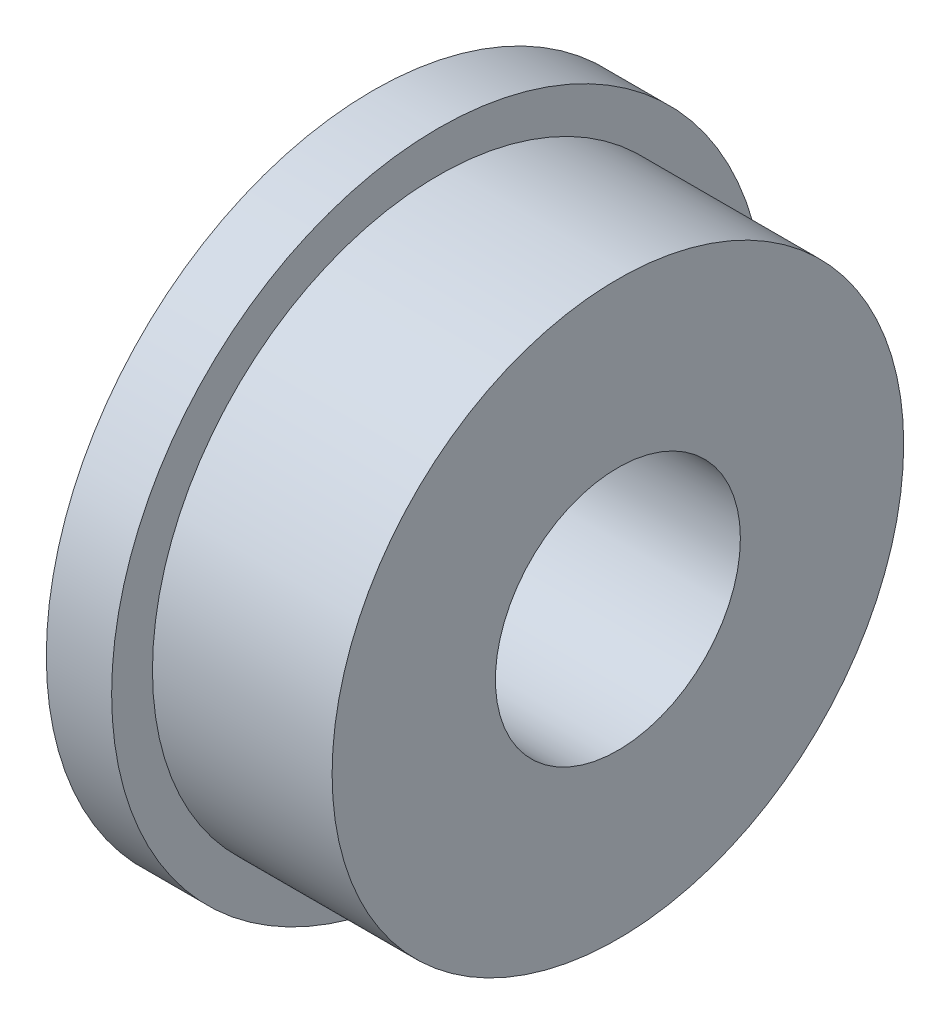
ISO-10303-21;
HEADER;
FILE_DESCRIPTION(('STEP AP214'),'2;1');
FILE_NAME('part.step','',(''),(''),'','','');
FILE_SCHEMA(('AUTOMOTIVE_DESIGN { 1 0 10303 214 1 1 1 1 }'));
ENDSEC;
DATA;
#1=APPLICATION_CONTEXT('core data for automotive mechanical design processes');
#2=APPLICATION_PROTOCOL_DEFINITION('international standard','automotive_design',2000,#1);
#3=PRODUCT_CONTEXT('',#1,'mechanical');
#4=PRODUCT('Part','Part','',(#3));
#5=PRODUCT_RELATED_PRODUCT_CATEGORY('part','',(#4));
#6=PRODUCT_DEFINITION_FORMATION('','',#4);
#7=PRODUCT_DEFINITION_CONTEXT('part definition',#1,'design');
#8=PRODUCT_DEFINITION('design','',#6,#7);
#9=PRODUCT_DEFINITION_SHAPE('','',#8);
#10=(LENGTH_UNIT() NAMED_UNIT(*) SI_UNIT(.MILLI.,.METRE.));
#11=(NAMED_UNIT(*) PLANE_ANGLE_UNIT() SI_UNIT($,.RADIAN.));
#12=(NAMED_UNIT(*) SI_UNIT($,.STERADIAN.) SOLID_ANGLE_UNIT());
#13=UNCERTAINTY_MEASURE_WITH_UNIT(LENGTH_MEASURE(1.E-05),#10,'distance_accuracy_value','');
#14=(GEOMETRIC_REPRESENTATION_CONTEXT(3) GLOBAL_UNCERTAINTY_ASSIGNED_CONTEXT((#13)) GLOBAL_UNIT_ASSIGNED_CONTEXT((#10,
#11,#12)) REPRESENTATION_CONTEXT('',''));
#15=CARTESIAN_POINT('',(0.,0.,0.));
#16=DIRECTION('',(0.,0.,1.));
#17=DIRECTION('',(1.,0.,0.));
#18=AXIS2_PLACEMENT_3D('',#15,#16,#17);
#19=CARTESIAN_POINT('',(-12.8000000000006,667.332012286217,-379.357743681072));
#20=DIRECTION('',(-1.,0.,0.));
#21=DIRECTION('',(0.,0.,1.));
#22=AXIS2_PLACEMENT_3D('',#19,#20,#21);
#23=CYLINDRICAL_SURFACE('',#22,3.5);
#24=CARTESIAN_POINT('',(-15.0000000000005,667.332012286217,-379.357743681072));
#25=DIRECTION('',(-1.,0.,0.));
#26=DIRECTION('',(0.,0.,1.));
#27=AXIS2_PLACEMENT_3D('',#24,#25,#26);
#28=CIRCLE('',#27,3.5);
#29=CARTESIAN_POINT('',(-15.0000000000005,667.332012286217,-375.857743681072));
#30=VERTEX_POINT('',#29);
#31=EDGE_CURVE('E18',#30,#30,#28,.T.);
#32=ORIENTED_EDGE('',*,*,#31,.F.);
#33=EDGE_LOOP('',(#32));
#34=FACE_BOUND('',#33,.T.);
#35=CARTESIAN_POINT('',(-12.8000000000006,667.332012286217,-379.357743681072));
#36=DIRECTION('',(-1.,0.,0.));
#37=DIRECTION('',(0.,0.,1.));
#38=AXIS2_PLACEMENT_3D('',#35,#36,#37);
#39=CIRCLE('',#38,3.5);
#40=CARTESIAN_POINT('',(-12.8000000000006,667.332012286217,-375.857743681072));
#41=VERTEX_POINT('',#40);
#42=EDGE_CURVE('E34',#41,#41,#39,.F.);
#43=ORIENTED_EDGE('',*,*,#42,.F.);
#44=EDGE_LOOP('',(#43));
#45=FACE_BOUND('',#44,.T.);
#46=ADVANCED_FACE('F15',(#34,#45),#23,.T.);
#47=CARTESIAN_POINT('',(-15.0000000000005,663.332012286217,-375.357743681072));
#48=DIRECTION('',(1.,0.,0.));
#49=DIRECTION('',(0.,0.,-1.));
#50=AXIS2_PLACEMENT_3D('',#47,#48,#49);
#51=PLANE('',#50);
#52=ORIENTED_EDGE('',*,*,#31,.T.);
#53=EDGE_LOOP('',(#52));
#54=FACE_BOUND('',#53,.T.);
#55=CARTESIAN_POINT('',(-15.0000000000005,667.332012286217,-379.357743681072));
#56=DIRECTION('',(-1.,0.,0.));
#57=DIRECTION('',(0.,0.,1.));
#58=AXIS2_PLACEMENT_3D('',#55,#56,#57);
#59=CIRCLE('',#58,4.00000000000001);
#60=CARTESIAN_POINT('',(-15.0000000000005,667.332012286217,-375.357743681072));
#61=VERTEX_POINT('',#60);
#62=EDGE_CURVE('E32',#61,#61,#59,.T.);
#63=ORIENTED_EDGE('',*,*,#62,.F.);
#64=EDGE_LOOP('',(#63));
#65=FACE_BOUND('',#64,.T.);
#66=ADVANCED_FACE('F41',(#54,#65),#51,.T.);
#67=CARTESIAN_POINT('',(-12.8000000000006,670.832012286217,-375.857743681072));
#68=DIRECTION('',(1.,0.,0.));
#69=DIRECTION('',(0.,0.,-1.));
#70=AXIS2_PLACEMENT_3D('',#67,#68,#69);
#71=PLANE('',#70);
#72=CARTESIAN_POINT('',(-12.8000000000006,667.332012286217,-379.357743681072));
#73=DIRECTION('',(1.,0.,0.));
#74=DIRECTION('',(0.,0.,-1.));
#75=AXIS2_PLACEMENT_3D('',#72,#73,#74);
#76=CIRCLE('',#75,1.50000000000003);
#77=CARTESIAN_POINT('',(-12.8000000000006,667.332012286217,-380.857743681072));
#78=VERTEX_POINT('',#77);
#79=EDGE_CURVE('E27',#78,#78,#76,.F.);
#80=ORIENTED_EDGE('',*,*,#79,.T.);
#81=EDGE_LOOP('',(#80));
#82=FACE_BOUND('',#81,.T.);
#83=ORIENTED_EDGE('',*,*,#42,.T.);
#84=EDGE_LOOP('',(#83));
#85=FACE_BOUND('',#84,.T.);
#86=ADVANCED_FACE('F50',(#82,#85),#71,.T.);
#87=CARTESIAN_POINT('',(-15.0000000000005,667.332012286217,-379.357743681072));
#88=DIRECTION('',(-1.,0.,0.));
#89=DIRECTION('',(0.,0.,1.));
#90=AXIS2_PLACEMENT_3D('',#87,#88,#89);
#91=CYLINDRICAL_SURFACE('',#90,4.00000000000001);
#92=ORIENTED_EDGE('',*,*,#62,.T.);
#93=EDGE_LOOP('',(#92));
#94=FACE_BOUND('',#93,.T.);
#95=CARTESIAN_POINT('',(-15.8000000000006,667.332012286217,-379.357743681072));
#96=DIRECTION('',(-1.,0.,0.));
#97=DIRECTION('',(0.,0.,1.));
#98=AXIS2_PLACEMENT_3D('',#95,#96,#97);
#99=CIRCLE('',#98,4.00000000000001);
#100=CARTESIAN_POINT('',(-15.8000000000006,667.332012286217,-375.357743681072));
#101=VERTEX_POINT('',#100);
#102=EDGE_CURVE('E22',#101,#101,#99,.T.);
#103=ORIENTED_EDGE('',*,*,#102,.F.);
#104=EDGE_LOOP('',(#103));
#105=FACE_BOUND('',#104,.T.);
#106=ADVANCED_FACE('F58',(#94,#105),#91,.T.);
#107=CARTESIAN_POINT('',(-15.8000000000006,667.332012286217,-379.357743681072));
#108=DIRECTION('',(1.,0.,0.));
#109=DIRECTION('',(0.,0.,-1.));
#110=AXIS2_PLACEMENT_3D('',#107,#108,#109);
#111=CYLINDRICAL_SURFACE('',#110,1.50000000000003);
#112=CARTESIAN_POINT('',(-15.8000000000006,667.332012286217,-379.357743681072));
#113=DIRECTION('',(1.,0.,0.));
#114=DIRECTION('',(0.,0.,-1.));
#115=AXIS2_PLACEMENT_3D('',#112,#113,#114);
#116=CIRCLE('',#115,1.50000000000003);
#117=CARTESIAN_POINT('',(-15.8000000000006,667.332012286217,-380.857743681072));
#118=VERTEX_POINT('',#117);
#119=EDGE_CURVE('E10',#118,#118,#116,.T.);
#120=ORIENTED_EDGE('',*,*,#119,.F.);
#121=EDGE_LOOP('',(#120));
#122=FACE_BOUND('',#121,.T.);
#123=ORIENTED_EDGE('',*,*,#79,.F.);
#124=EDGE_LOOP('',(#123));
#125=FACE_BOUND('',#124,.T.);
#126=ADVANCED_FACE('F53',(#122,#125),#111,.F.);
#127=CARTESIAN_POINT('',(-15.8000000000006,663.332012286217,-383.357743681072));
#128=DIRECTION('',(-1.,0.,0.));
#129=DIRECTION('',(0.,0.,1.));
#130=AXIS2_PLACEMENT_3D('',#127,#128,#129);
#131=PLANE('',#130);
#132=ORIENTED_EDGE('',*,*,#119,.T.);
#133=EDGE_LOOP('',(#132));
#134=FACE_BOUND('',#133,.T.);
#135=ORIENTED_EDGE('',*,*,#102,.T.);
#136=EDGE_LOOP('',(#135));
#137=FACE_BOUND('',#136,.T.);
#138=ADVANCED_FACE('F51',(#134,#137),#131,.T.);
#139=CLOSED_SHELL('',(#46,#66,#86,#106,#126,#138));
#140=MANIFOLD_SOLID_BREP('B1',#139);
#141=ADVANCED_BREP_SHAPE_REPRESENTATION('',(#18,#140),#14);
#142=SHAPE_DEFINITION_REPRESENTATION(#9,#141);
ENDSEC;
END-ISO-10303-21;
